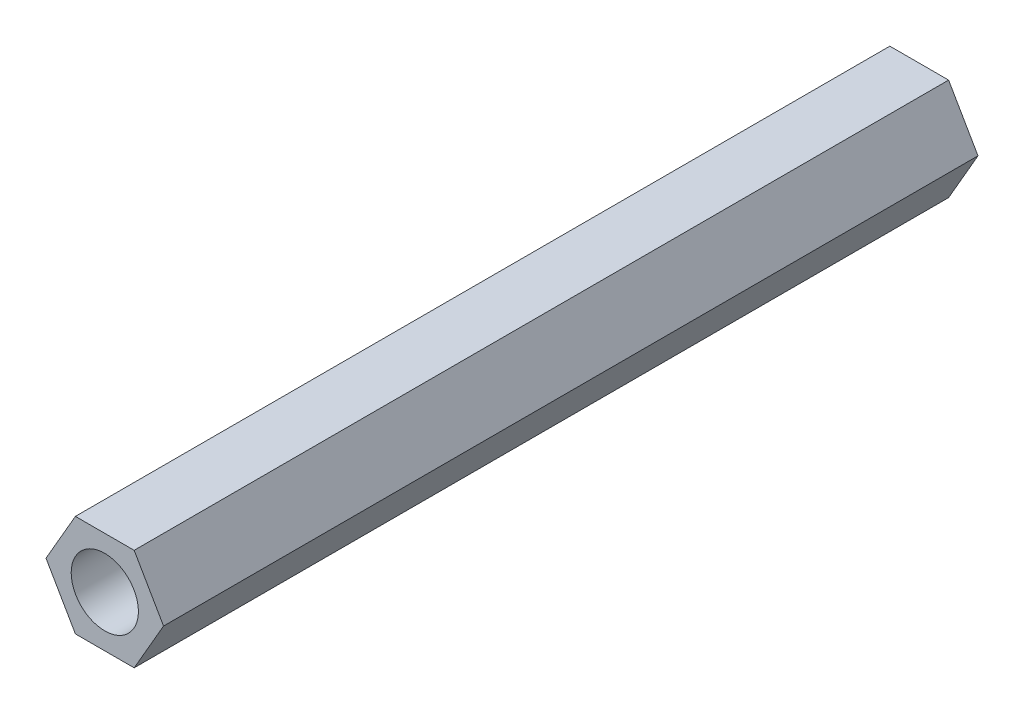
ISO-10303-21;
HEADER;
FILE_DESCRIPTION(('STEP AP214'),'2;1');
FILE_NAME('part.step','',(''),(''),'','','');
FILE_SCHEMA(('AUTOMOTIVE_DESIGN { 1 0 10303 214 1 1 1 1 }'));
ENDSEC;
DATA;
#1=APPLICATION_CONTEXT('core data for automotive mechanical design processes');
#2=APPLICATION_PROTOCOL_DEFINITION('international standard','automotive_design',2000,#1);
#3=PRODUCT_CONTEXT('',#1,'mechanical');
#4=PRODUCT('Part','Part','',(#3));
#5=PRODUCT_RELATED_PRODUCT_CATEGORY('part','',(#4));
#6=PRODUCT_DEFINITION_FORMATION('','',#4);
#7=PRODUCT_DEFINITION_CONTEXT('part definition',#1,'design');
#8=PRODUCT_DEFINITION('design','',#6,#7);
#9=PRODUCT_DEFINITION_SHAPE('','',#8);
#10=(LENGTH_UNIT() NAMED_UNIT(*) SI_UNIT(.MILLI.,.METRE.));
#11=(NAMED_UNIT(*) PLANE_ANGLE_UNIT() SI_UNIT($,.RADIAN.));
#12=(NAMED_UNIT(*) SI_UNIT($,.STERADIAN.) SOLID_ANGLE_UNIT());
#13=UNCERTAINTY_MEASURE_WITH_UNIT(LENGTH_MEASURE(1.E-05),#10,'distance_accuracy_value','');
#14=(GEOMETRIC_REPRESENTATION_CONTEXT(3) GLOBAL_UNCERTAINTY_ASSIGNED_CONTEXT((#13)) GLOBAL_UNIT_ASSIGNED_CONTEXT((#10,
#11,#12)) REPRESENTATION_CONTEXT('',''));
#15=CARTESIAN_POINT('',(0.,0.,0.));
#16=DIRECTION('',(0.,0.,1.));
#17=DIRECTION('',(1.,0.,0.));
#18=AXIS2_PLACEMENT_3D('',#15,#16,#17);
#19=CARTESIAN_POINT('',(1.83308710467706,3.175,25.4));
#20=DIRECTION('',(0.,-1.,0.));
#21=DIRECTION('',(0.,0.,-1.));
#22=AXIS2_PLACEMENT_3D('',#19,#20,#21);
#23=PLANE('',#22);
#24=DIRECTION('',(0.,0.,1.));
#25=VECTOR('',#24,1.);
#26=CARTESIAN_POINT('',(-1.83308710467706,3.175,25.4));
#27=LINE('',#26,#25);
#28=CARTESIAN_POINT('',(-1.83308710467706,3.175,-25.4));
#29=VERTEX_POINT('',#28);
#30=CARTESIAN_POINT('',(-1.83308710467706,3.175,25.4));
#31=VERTEX_POINT('',#30);
#32=EDGE_CURVE('E66',#29,#31,#27,.T.);
#33=ORIENTED_EDGE('',*,*,#32,.T.);
#34=DIRECTION('',(1.,0.,0.));
#35=VECTOR('',#34,1.);
#36=CARTESIAN_POINT('',(-5.49926131403119,3.175,25.4));
#37=LINE('',#36,#35);
#38=CARTESIAN_POINT('',(1.83308710467706,3.175,25.4));
#39=VERTEX_POINT('',#38);
#40=EDGE_CURVE('E106',#39,#31,#37,.F.);
#41=ORIENTED_EDGE('',*,*,#40,.F.);
#42=DIRECTION('',(0.,0.,1.));
#43=VECTOR('',#42,1.);
#44=CARTESIAN_POINT('',(1.83308710467706,3.175,25.4));
#45=LINE('',#44,#43);
#46=CARTESIAN_POINT('',(1.83308710467706,3.175,-25.4));
#47=VERTEX_POINT('',#46);
#48=EDGE_CURVE('E93',#39,#47,#45,.F.);
#49=ORIENTED_EDGE('',*,*,#48,.T.);
#50=DIRECTION('',(1.,0.,0.));
#51=VECTOR('',#50,1.);
#52=CARTESIAN_POINT('',(-5.49926131403119,3.175,-25.4));
#53=LINE('',#52,#51);
#54=EDGE_CURVE('E107',#47,#29,#53,.F.);
#55=ORIENTED_EDGE('',*,*,#54,.T.);
#56=EDGE_LOOP('',(#33,#41,#49,#55));
#57=FACE_BOUND('',#56,.T.);
#58=ADVANCED_FACE('F17',(#57),#23,.F.);
#59=CARTESIAN_POINT('',(-1.83308710467706,3.175,25.4));
#60=DIRECTION('',(0.866025403784439,-0.5,0.));
#61=DIRECTION('',(0.5,0.866025403784439,0.));
#62=AXIS2_PLACEMENT_3D('',#59,#60,#61);
#63=PLANE('',#62);
#64=DIRECTION('',(0.,0.,1.));
#65=VECTOR('',#64,1.);
#66=CARTESIAN_POINT('',(-3.66617420935413,0.,25.4));
#67=LINE('',#66,#65);
#68=CARTESIAN_POINT('',(-3.66617420935413,0.,-25.4));
#69=VERTEX_POINT('',#68);
#70=CARTESIAN_POINT('',(-3.66617420935413,0.,25.4));
#71=VERTEX_POINT('',#70);
#72=EDGE_CURVE('E73',#69,#71,#67,.T.);
#73=ORIENTED_EDGE('',*,*,#72,.T.);
#74=DIRECTION('',(-0.5,-0.866025403784439,0.));
#75=VECTOR('',#74,1.);
#76=CARTESIAN_POINT('',(-1.83308710467706,3.175,25.4));
#77=LINE('',#76,#75);
#78=EDGE_CURVE('E108',#31,#71,#77,.T.);
#79=ORIENTED_EDGE('',*,*,#78,.F.);
#80=ORIENTED_EDGE('',*,*,#32,.F.);
#81=DIRECTION('',(-0.5,-0.866025403784439,0.));
#82=VECTOR('',#81,1.);
#83=CARTESIAN_POINT('',(-1.83308710467706,3.175,-25.4));
#84=LINE('',#83,#82);
#85=EDGE_CURVE('E86',#29,#69,#84,.T.);
#86=ORIENTED_EDGE('',*,*,#85,.T.);
#87=EDGE_LOOP('',(#73,#79,#80,#86));
#88=FACE_BOUND('',#87,.T.);
#89=ADVANCED_FACE('F92',(#88),#63,.F.);
#90=CARTESIAN_POINT('',(-3.66617420935413,0.,25.4));
#91=DIRECTION('',(0.866025403784439,0.5,0.));
#92=DIRECTION('',(-0.5,0.866025403784439,0.));
#93=AXIS2_PLACEMENT_3D('',#90,#91,#92);
#94=PLANE('',#93);
#95=DIRECTION('',(0.,0.,1.));
#96=VECTOR('',#95,1.);
#97=CARTESIAN_POINT('',(-1.83308710467706,-3.175,25.4));
#98=LINE('',#97,#96);
#99=CARTESIAN_POINT('',(-1.83308710467706,-3.175,-25.4));
#100=VERTEX_POINT('',#99);
#101=CARTESIAN_POINT('',(-1.83308710467706,-3.175,25.4));
#102=VERTEX_POINT('',#101);
#103=EDGE_CURVE('E79',#100,#102,#98,.T.);
#104=ORIENTED_EDGE('',*,*,#103,.T.);
#105=DIRECTION('',(0.5,-0.866025403784439,0.));
#106=VECTOR('',#105,1.);
#107=CARTESIAN_POINT('',(-3.66617420935413,0.,25.4));
#108=LINE('',#107,#106);
#109=EDGE_CURVE('E78',#71,#102,#108,.T.);
#110=ORIENTED_EDGE('',*,*,#109,.F.);
#111=ORIENTED_EDGE('',*,*,#72,.F.);
#112=DIRECTION('',(0.5,-0.866025403784439,0.));
#113=VECTOR('',#112,1.);
#114=CARTESIAN_POINT('',(-3.66617420935413,0.,-25.4));
#115=LINE('',#114,#113);
#116=EDGE_CURVE('E77',#69,#100,#115,.T.);
#117=ORIENTED_EDGE('',*,*,#116,.T.);
#118=EDGE_LOOP('',(#104,#110,#111,#117));
#119=FACE_BOUND('',#118,.T.);
#120=ADVANCED_FACE('F76',(#119),#94,.F.);
#121=CARTESIAN_POINT('',(-1.83308710467706,-3.175,25.4));
#122=DIRECTION('',(0.,1.,0.));
#123=DIRECTION('',(0.,0.,1.));
#124=AXIS2_PLACEMENT_3D('',#121,#122,#123);
#125=PLANE('',#124);
#126=DIRECTION('',(0.,0.,1.));
#127=VECTOR('',#126,1.);
#128=CARTESIAN_POINT('',(1.83308710467706,-3.175,25.4));
#129=LINE('',#128,#127);
#130=CARTESIAN_POINT('',(1.83308710467706,-3.175,-25.4));
#131=VERTEX_POINT('',#130);
#132=CARTESIAN_POINT('',(1.83308710467706,-3.175,25.4));
#133=VERTEX_POINT('',#132);
#134=EDGE_CURVE('E100',#131,#133,#129,.T.);
#135=ORIENTED_EDGE('',*,*,#134,.T.);
#136=DIRECTION('',(1.,0.,0.));
#137=VECTOR('',#136,1.);
#138=CARTESIAN_POINT('',(-5.49926131403119,-3.175,25.4));
#139=LINE('',#138,#137);
#140=EDGE_CURVE('E110',#102,#133,#139,.T.);
#141=ORIENTED_EDGE('',*,*,#140,.F.);
#142=ORIENTED_EDGE('',*,*,#103,.F.);
#143=DIRECTION('',(1.,0.,0.));
#144=VECTOR('',#143,1.);
#145=CARTESIAN_POINT('',(-5.49926131403119,-3.175,-25.4));
#146=LINE('',#145,#144);
#147=EDGE_CURVE('E90',#100,#131,#146,.T.);
#148=ORIENTED_EDGE('',*,*,#147,.T.);
#149=EDGE_LOOP('',(#135,#141,#142,#148));
#150=FACE_BOUND('',#149,.T.);
#151=ADVANCED_FACE('F122',(#150),#125,.F.);
#152=CARTESIAN_POINT('',(1.83308710467706,-3.175,25.4));
#153=DIRECTION('',(-0.866025403784439,0.5,0.));
#154=DIRECTION('',(-0.5,-0.866025403784439,0.));
#155=AXIS2_PLACEMENT_3D('',#152,#153,#154);
#156=PLANE('',#155);
#157=DIRECTION('',(0.,0.,1.));
#158=VECTOR('',#157,1.);
#159=CARTESIAN_POINT('',(3.66617420935412,0.,25.4));
#160=LINE('',#159,#158);
#161=CARTESIAN_POINT('',(3.66617420935412,0.,-25.4));
#162=VERTEX_POINT('',#161);
#163=CARTESIAN_POINT('',(3.66617420935412,0.,25.4));
#164=VERTEX_POINT('',#163);
#165=EDGE_CURVE('E95',#162,#164,#160,.T.);
#166=ORIENTED_EDGE('',*,*,#165,.T.);
#167=DIRECTION('',(0.5,0.866025403784439,0.));
#168=VECTOR('',#167,1.);
#169=CARTESIAN_POINT('',(1.83308710467706,-3.175,25.4));
#170=LINE('',#169,#168);
#171=EDGE_CURVE('E33',#133,#164,#170,.T.);
#172=ORIENTED_EDGE('',*,*,#171,.F.);
#173=ORIENTED_EDGE('',*,*,#134,.F.);
#174=DIRECTION('',(0.5,0.866025403784439,0.));
#175=VECTOR('',#174,1.);
#176=CARTESIAN_POINT('',(1.83308710467706,-3.175,-25.4));
#177=LINE('',#176,#175);
#178=EDGE_CURVE('E119',#131,#162,#177,.T.);
#179=ORIENTED_EDGE('',*,*,#178,.T.);
#180=EDGE_LOOP('',(#166,#172,#173,#179));
#181=FACE_BOUND('',#180,.T.);
#182=ADVANCED_FACE('F150',(#181),#156,.F.);
#183=CARTESIAN_POINT('',(3.66617420935412,0.,25.4));
#184=DIRECTION('',(-0.866025403784439,-0.5,0.));
#185=DIRECTION('',(0.5,-0.866025403784439,0.));
#186=AXIS2_PLACEMENT_3D('',#183,#184,#185);
#187=PLANE('',#186);
#188=ORIENTED_EDGE('',*,*,#48,.F.);
#189=DIRECTION('',(-0.5,0.866025403784439,0.));
#190=VECTOR('',#189,1.);
#191=CARTESIAN_POINT('',(3.66617420935412,0.,25.4));
#192=LINE('',#191,#190);
#193=EDGE_CURVE('E124',#164,#39,#192,.T.);
#194=ORIENTED_EDGE('',*,*,#193,.F.);
#195=ORIENTED_EDGE('',*,*,#165,.F.);
#196=DIRECTION('',(-0.5,0.866025403784439,0.));
#197=VECTOR('',#196,1.);
#198=CARTESIAN_POINT('',(3.66617420935412,0.,-25.4));
#199=LINE('',#198,#197);
#200=EDGE_CURVE('E116',#162,#47,#199,.T.);
#201=ORIENTED_EDGE('',*,*,#200,.T.);
#202=EDGE_LOOP('',(#188,#194,#195,#201));
#203=FACE_BOUND('',#202,.T.);
#204=ADVANCED_FACE('F145',(#203),#187,.F.);
#205=CARTESIAN_POINT('',(-5.49926131403119,3.175,-25.4));
#206=DIRECTION('',(0.,0.,1.));
#207=DIRECTION('',(1.,0.,0.));
#208=AXIS2_PLACEMENT_3D('',#205,#206,#207);
#209=PLANE('',#208);
#210=CARTESIAN_POINT('',(0.,0.,-25.4));
#211=DIRECTION('',(0.,0.,-1.));
#212=DIRECTION('',(-1.,0.,0.));
#213=AXIS2_PLACEMENT_3D('',#210,#211,#212);
#214=CIRCLE('',#213,2.0955);
#215=CARTESIAN_POINT('',(-2.0955,0.,-25.4));
#216=VERTEX_POINT('',#215);
#217=EDGE_CURVE('E20',#216,#216,#214,.F.);
#218=ORIENTED_EDGE('',*,*,#217,.T.);
#219=EDGE_LOOP('',(#218));
#220=FACE_BOUND('',#219,.T.);
#221=ORIENTED_EDGE('',*,*,#200,.F.);
#222=ORIENTED_EDGE('',*,*,#178,.F.);
#223=ORIENTED_EDGE('',*,*,#147,.F.);
#224=ORIENTED_EDGE('',*,*,#116,.F.);
#225=ORIENTED_EDGE('',*,*,#85,.F.);
#226=ORIENTED_EDGE('',*,*,#54,.F.);
#227=EDGE_LOOP('',(#221,#222,#223,#224,#225,#226));
#228=FACE_BOUND('',#227,.T.);
#229=ADVANCED_FACE('F84',(#220,#228),#209,.F.);
#230=CARTESIAN_POINT('',(-5.49926131403119,3.175,25.4));
#231=DIRECTION('',(0.,0.,1.));
#232=DIRECTION('',(1.,0.,0.));
#233=AXIS2_PLACEMENT_3D('',#230,#231,#232);
#234=PLANE('',#233);
#235=CARTESIAN_POINT('',(0.,0.,25.4));
#236=DIRECTION('',(0.,0.,-1.));
#237=DIRECTION('',(-1.,0.,0.));
#238=AXIS2_PLACEMENT_3D('',#235,#236,#237);
#239=CIRCLE('',#238,2.0955);
#240=CARTESIAN_POINT('',(-2.0955,0.,25.4));
#241=VERTEX_POINT('',#240);
#242=EDGE_CURVE('E11',#241,#241,#239,.T.);
#243=ORIENTED_EDGE('',*,*,#242,.T.);
#244=EDGE_LOOP('',(#243));
#245=FACE_BOUND('',#244,.T.);
#246=ORIENTED_EDGE('',*,*,#171,.T.);
#247=ORIENTED_EDGE('',*,*,#193,.T.);
#248=ORIENTED_EDGE('',*,*,#40,.T.);
#249=ORIENTED_EDGE('',*,*,#78,.T.);
#250=ORIENTED_EDGE('',*,*,#109,.T.);
#251=ORIENTED_EDGE('',*,*,#140,.T.);
#252=EDGE_LOOP('',(#246,#247,#248,#249,#250,#251));
#253=FACE_BOUND('',#252,.T.);
#254=ADVANCED_FACE('F135',(#245,#253),#234,.T.);
#255=CARTESIAN_POINT('',(0.,0.,25.4));
#256=DIRECTION('',(0.,0.,-1.));
#257=DIRECTION('',(-1.,0.,0.));
#258=AXIS2_PLACEMENT_3D('',#255,#256,#257);
#259=CYLINDRICAL_SURFACE('',#258,2.0955);
#260=ORIENTED_EDGE('',*,*,#217,.F.);
#261=EDGE_LOOP('',(#260));
#262=FACE_BOUND('',#261,.T.);
#263=ORIENTED_EDGE('',*,*,#242,.F.);
#264=EDGE_LOOP('',(#263));
#265=FACE_BOUND('',#264,.T.);
#266=ADVANCED_FACE('F132',(#262,#265),#259,.F.);
#267=CLOSED_SHELL('',(#58,#89,#120,#151,#182,#204,#229,#254,#266));
#268=MANIFOLD_SOLID_BREP('B1',#267);
#269=ADVANCED_BREP_SHAPE_REPRESENTATION('',(#18,#268),#14);
#270=SHAPE_DEFINITION_REPRESENTATION(#9,#269);
ENDSEC;
END-ISO-10303-21;
